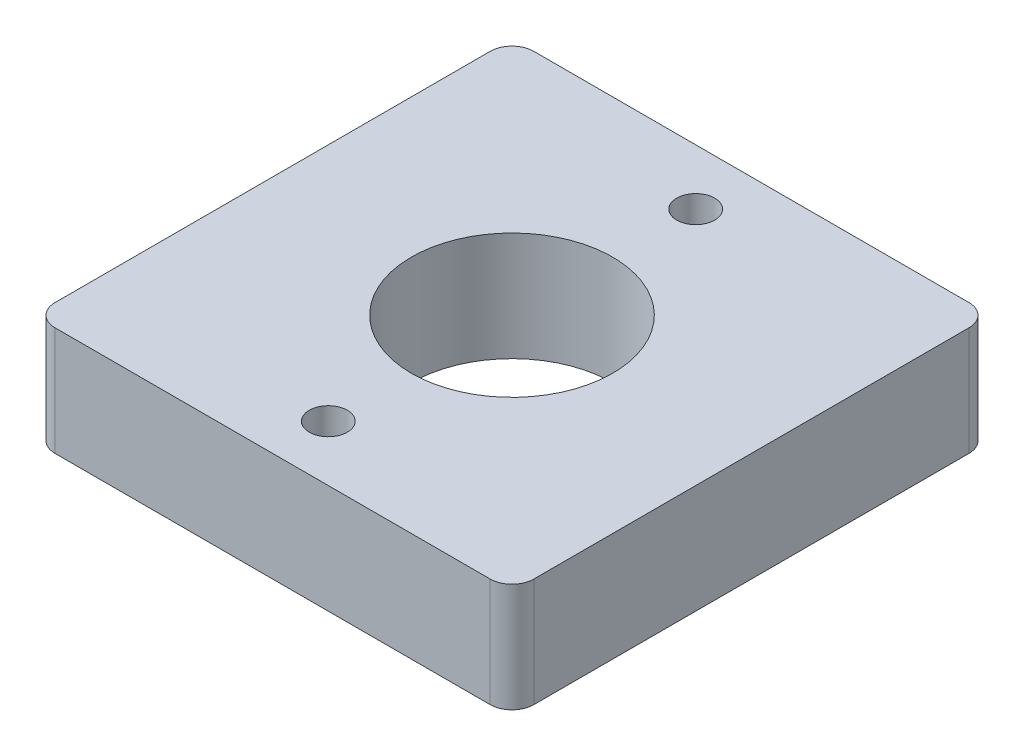
ISO-10303-21;
HEADER;
FILE_DESCRIPTION(('STEP AP214'),'2;1');
FILE_NAME('part.step','',(''),(''),'','','');
FILE_SCHEMA(('AUTOMOTIVE_DESIGN { 1 0 10303 214 1 1 1 1 }'));
ENDSEC;
DATA;
#1=APPLICATION_CONTEXT('core data for automotive mechanical design processes');
#2=APPLICATION_PROTOCOL_DEFINITION('international standard','automotive_design',2000,#1);
#3=PRODUCT_CONTEXT('',#1,'mechanical');
#4=PRODUCT('Part','Part','',(#3));
#5=PRODUCT_RELATED_PRODUCT_CATEGORY('part','',(#4));
#6=PRODUCT_DEFINITION_FORMATION('','',#4);
#7=PRODUCT_DEFINITION_CONTEXT('part definition',#1,'design');
#8=PRODUCT_DEFINITION('design','',#6,#7);
#9=PRODUCT_DEFINITION_SHAPE('','',#8);
#10=(LENGTH_UNIT() NAMED_UNIT(*) SI_UNIT(.MILLI.,.METRE.));
#11=(NAMED_UNIT(*) PLANE_ANGLE_UNIT() SI_UNIT($,.RADIAN.));
#12=(NAMED_UNIT(*) SI_UNIT($,.STERADIAN.) SOLID_ANGLE_UNIT());
#13=UNCERTAINTY_MEASURE_WITH_UNIT(LENGTH_MEASURE(1.E-05),#10,'distance_accuracy_value','');
#14=(GEOMETRIC_REPRESENTATION_CONTEXT(3) GLOBAL_UNCERTAINTY_ASSIGNED_CONTEXT((#13)) GLOBAL_UNIT_ASSIGNED_CONTEXT((#10,
#11,#12)) REPRESENTATION_CONTEXT('',''));
#15=CARTESIAN_POINT('',(0.,0.,0.));
#16=DIRECTION('',(0.,0.,1.));
#17=DIRECTION('',(1.,0.,0.));
#18=AXIS2_PLACEMENT_3D('',#15,#16,#17);
#19=CARTESIAN_POINT('',(0.,10.,0.));
#20=DIRECTION('',(0.,-1.,0.));
#21=DIRECTION('',(0.,0.,-1.));
#22=AXIS2_PLACEMENT_3D('',#19,#20,#21);
#23=PLANE('',#22);
#24=CARTESIAN_POINT('',(0.,10.,-16.88));
#25=DIRECTION('',(0.,1.,0.));
#26=DIRECTION('',(0.,0.,1.));
#27=AXIS2_PLACEMENT_3D('',#24,#25,#26);
#28=CIRCLE('',#27,1.75);
#29=CARTESIAN_POINT('',(0.,10.,-15.13));
#30=VERTEX_POINT('',#29);
#31=EDGE_CURVE('E223',#30,#30,#28,.T.);
#32=ORIENTED_EDGE('',*,*,#31,.F.);
#33=EDGE_LOOP('',(#32));
#34=FACE_BOUND('',#33,.T.);
#35=CARTESIAN_POINT('',(0.,10.,16.88));
#36=DIRECTION('',(0.,1.,0.));
#37=DIRECTION('',(0.,0.,1.));
#38=AXIS2_PLACEMENT_3D('',#35,#36,#37);
#39=CIRCLE('',#38,1.75);
#40=CARTESIAN_POINT('',(0.,10.,18.63));
#41=VERTEX_POINT('',#40);
#42=EDGE_CURVE('E215',#41,#41,#39,.T.);
#43=ORIENTED_EDGE('',*,*,#42,.F.);
#44=EDGE_LOOP('',(#43));
#45=FACE_BOUND('',#44,.T.);
#46=DIRECTION('',(0.,0.,-1.));
#47=VECTOR('',#46,1.);
#48=CARTESIAN_POINT('',(22.,10.,22.));
#49=LINE('',#48,#47);
#50=CARTESIAN_POINT('',(22.,10.,20.));
#51=VERTEX_POINT('',#50);
#52=CARTESIAN_POINT('',(22.,10.,-20.));
#53=VERTEX_POINT('',#52);
#54=EDGE_CURVE('E150',#51,#53,#49,.T.);
#55=ORIENTED_EDGE('',*,*,#54,.T.);
#56=CARTESIAN_POINT('',(20.,10.,-20.));
#57=DIRECTION('',(0.,-1.,0.));
#58=DIRECTION('',(0.,0.,-1.));
#59=AXIS2_PLACEMENT_3D('',#56,#57,#58);
#60=CIRCLE('',#59,2.);
#61=CARTESIAN_POINT('',(20.,10.,-22.));
#62=VERTEX_POINT('',#61);
#63=EDGE_CURVE('E174',#53,#62,#60,.F.);
#64=ORIENTED_EDGE('',*,*,#63,.T.);
#65=DIRECTION('',(-1.,0.,0.));
#66=VECTOR('',#65,1.);
#67=CARTESIAN_POINT('',(-22.,10.,-22.));
#68=LINE('',#67,#66);
#69=CARTESIAN_POINT('',(-20.,10.,-22.));
#70=VERTEX_POINT('',#69);
#71=EDGE_CURVE('E127',#62,#70,#68,.T.);
#72=ORIENTED_EDGE('',*,*,#71,.T.);
#73=CARTESIAN_POINT('',(-20.,10.,-20.));
#74=DIRECTION('',(0.,-1.,0.));
#75=DIRECTION('',(0.,0.,-1.));
#76=AXIS2_PLACEMENT_3D('',#73,#74,#75);
#77=CIRCLE('',#76,2.);
#78=CARTESIAN_POINT('',(-22.,10.,-20.));
#79=VERTEX_POINT('',#78);
#80=EDGE_CURVE('E166',#70,#79,#77,.F.);
#81=ORIENTED_EDGE('',*,*,#80,.T.);
#82=DIRECTION('',(0.,0.,1.));
#83=VECTOR('',#82,1.);
#84=CARTESIAN_POINT('',(-22.,10.,22.));
#85=LINE('',#84,#83);
#86=CARTESIAN_POINT('',(-22.,10.,20.));
#87=VERTEX_POINT('',#86);
#88=EDGE_CURVE('E189',#79,#87,#85,.T.);
#89=ORIENTED_EDGE('',*,*,#88,.T.);
#90=CARTESIAN_POINT('',(-20.,10.,20.));
#91=DIRECTION('',(0.,-1.,0.));
#92=DIRECTION('',(0.,0.,-1.));
#93=AXIS2_PLACEMENT_3D('',#90,#91,#92);
#94=CIRCLE('',#93,2.);
#95=CARTESIAN_POINT('',(-20.,10.,22.));
#96=VERTEX_POINT('',#95);
#97=EDGE_CURVE('E62',#87,#96,#94,.F.);
#98=ORIENTED_EDGE('',*,*,#97,.T.);
#99=DIRECTION('',(1.,0.,0.));
#100=VECTOR('',#99,1.);
#101=CARTESIAN_POINT('',(-22.,10.,22.));
#102=LINE('',#101,#100);
#103=CARTESIAN_POINT('',(20.,10.,22.));
#104=VERTEX_POINT('',#103);
#105=EDGE_CURVE('E152',#96,#104,#102,.T.);
#106=ORIENTED_EDGE('',*,*,#105,.T.);
#107=CARTESIAN_POINT('',(20.,10.,20.));
#108=DIRECTION('',(0.,-1.,0.));
#109=DIRECTION('',(0.,0.,-1.));
#110=AXIS2_PLACEMENT_3D('',#107,#108,#109);
#111=CIRCLE('',#110,2.);
#112=EDGE_CURVE('E171',#104,#51,#111,.F.);
#113=ORIENTED_EDGE('',*,*,#112,.T.);
#114=EDGE_LOOP('',(#55,#64,#72,#81,#89,#98,#106,#113));
#115=FACE_BOUND('',#114,.T.);
#116=CARTESIAN_POINT('',(0.,10.,0.));
#117=DIRECTION('',(0.,1.,0.));
#118=DIRECTION('',(0.,0.,1.));
#119=AXIS2_PLACEMENT_3D('',#116,#117,#118);
#120=CIRCLE('',#119,9.25);
#121=CARTESIAN_POINT('',(0.,10.,9.24999999999999));
#122=VERTEX_POINT('',#121);
#123=EDGE_CURVE('E144',#122,#122,#120,.T.);
#124=ORIENTED_EDGE('',*,*,#123,.F.);
#125=EDGE_LOOP('',(#124));
#126=FACE_BOUND('',#125,.T.);
#127=ADVANCED_FACE('F39',(#34,#45,#115,#126),#23,.F.);
#128=CARTESIAN_POINT('',(0.,0.,0.));
#129=DIRECTION('',(0.,-1.,0.));
#130=DIRECTION('',(0.,0.,-1.));
#131=AXIS2_PLACEMENT_3D('',#128,#129,#130);
#132=PLANE('',#131);
#133=CARTESIAN_POINT('',(0.,0.,-16.88));
#134=DIRECTION('',(0.,1.,0.));
#135=DIRECTION('',(0.,0.,1.));
#136=AXIS2_PLACEMENT_3D('',#133,#134,#135);
#137=CIRCLE('',#136,1.75);
#138=CARTESIAN_POINT('',(0.,0.,-15.13));
#139=VERTEX_POINT('',#138);
#140=EDGE_CURVE('E211',#139,#139,#137,.T.);
#141=ORIENTED_EDGE('',*,*,#140,.T.);
#142=EDGE_LOOP('',(#141));
#143=FACE_BOUND('',#142,.T.);
#144=CARTESIAN_POINT('',(0.,0.,16.88));
#145=DIRECTION('',(0.,1.,0.));
#146=DIRECTION('',(0.,0.,1.));
#147=AXIS2_PLACEMENT_3D('',#144,#145,#146);
#148=CIRCLE('',#147,1.75);
#149=CARTESIAN_POINT('',(0.,0.,18.63));
#150=VERTEX_POINT('',#149);
#151=EDGE_CURVE('E219',#150,#150,#148,.T.);
#152=ORIENTED_EDGE('',*,*,#151,.T.);
#153=EDGE_LOOP('',(#152));
#154=FACE_BOUND('',#153,.T.);
#155=DIRECTION('',(-1.,0.,0.));
#156=VECTOR('',#155,1.);
#157=CARTESIAN_POINT('',(-22.,0.,-22.));
#158=LINE('',#157,#156);
#159=CARTESIAN_POINT('',(20.,0.,-22.));
#160=VERTEX_POINT('',#159);
#161=CARTESIAN_POINT('',(-20.,0.,-22.));
#162=VERTEX_POINT('',#161);
#163=EDGE_CURVE('E124',#160,#162,#158,.T.);
#164=ORIENTED_EDGE('',*,*,#163,.F.);
#165=CARTESIAN_POINT('',(20.,0.,-20.));
#166=DIRECTION('',(0.,-1.,0.));
#167=DIRECTION('',(0.,0.,-1.));
#168=AXIS2_PLACEMENT_3D('',#165,#166,#167);
#169=CIRCLE('',#168,2.);
#170=CARTESIAN_POINT('',(22.,0.,-20.));
#171=VERTEX_POINT('',#170);
#172=EDGE_CURVE('E106',#160,#171,#169,.T.);
#173=ORIENTED_EDGE('',*,*,#172,.T.);
#174=DIRECTION('',(0.,0.,-1.));
#175=VECTOR('',#174,1.);
#176=CARTESIAN_POINT('',(22.,0.,22.));
#177=LINE('',#176,#175);
#178=CARTESIAN_POINT('',(22.,0.,20.));
#179=VERTEX_POINT('',#178);
#180=EDGE_CURVE('E137',#179,#171,#177,.T.);
#181=ORIENTED_EDGE('',*,*,#180,.F.);
#182=CARTESIAN_POINT('',(20.,0.,20.));
#183=DIRECTION('',(0.,-1.,0.));
#184=DIRECTION('',(0.,0.,-1.));
#185=AXIS2_PLACEMENT_3D('',#182,#183,#184);
#186=CIRCLE('',#185,2.);
#187=CARTESIAN_POINT('',(20.,0.,22.));
#188=VERTEX_POINT('',#187);
#189=EDGE_CURVE('E118',#179,#188,#186,.T.);
#190=ORIENTED_EDGE('',*,*,#189,.T.);
#191=DIRECTION('',(1.,0.,0.));
#192=VECTOR('',#191,1.);
#193=CARTESIAN_POINT('',(-22.,0.,22.));
#194=LINE('',#193,#192);
#195=CARTESIAN_POINT('',(-20.,0.,22.));
#196=VERTEX_POINT('',#195);
#197=EDGE_CURVE('E142',#196,#188,#194,.T.);
#198=ORIENTED_EDGE('',*,*,#197,.F.);
#199=CARTESIAN_POINT('',(-20.,0.,20.));
#200=DIRECTION('',(0.,-1.,0.));
#201=DIRECTION('',(0.,0.,-1.));
#202=AXIS2_PLACEMENT_3D('',#199,#200,#201);
#203=CIRCLE('',#202,2.);
#204=CARTESIAN_POINT('',(-22.,0.,20.));
#205=VERTEX_POINT('',#204);
#206=EDGE_CURVE('E156',#196,#205,#203,.T.);
#207=ORIENTED_EDGE('',*,*,#206,.T.);
#208=DIRECTION('',(0.,0.,1.));
#209=VECTOR('',#208,1.);
#210=CARTESIAN_POINT('',(-22.,0.,22.));
#211=LINE('',#210,#209);
#212=CARTESIAN_POINT('',(-22.,0.,-20.));
#213=VERTEX_POINT('',#212);
#214=EDGE_CURVE('E136',#213,#205,#211,.T.);
#215=ORIENTED_EDGE('',*,*,#214,.F.);
#216=CARTESIAN_POINT('',(-20.,0.,-20.));
#217=DIRECTION('',(0.,-1.,0.));
#218=DIRECTION('',(0.,0.,-1.));
#219=AXIS2_PLACEMENT_3D('',#216,#217,#218);
#220=CIRCLE('',#219,2.);
#221=EDGE_CURVE('E129',#213,#162,#220,.T.);
#222=ORIENTED_EDGE('',*,*,#221,.T.);
#223=EDGE_LOOP('',(#164,#173,#181,#190,#198,#207,#215,#222));
#224=FACE_BOUND('',#223,.T.);
#225=CARTESIAN_POINT('',(0.,0.,0.));
#226=DIRECTION('',(0.,1.,0.));
#227=DIRECTION('',(0.,0.,1.));
#228=AXIS2_PLACEMENT_3D('',#225,#226,#227);
#229=CIRCLE('',#228,9.25);
#230=CARTESIAN_POINT('',(0.,0.,9.24999999999999));
#231=VERTEX_POINT('',#230);
#232=EDGE_CURVE('E207',#231,#231,#229,.T.);
#233=ORIENTED_EDGE('',*,*,#232,.T.);
#234=EDGE_LOOP('',(#233));
#235=FACE_BOUND('',#234,.T.);
#236=ADVANCED_FACE('F132',(#143,#154,#224,#235),#132,.T.);
#237=CARTESIAN_POINT('',(22.,10.,22.));
#238=DIRECTION('',(-1.,0.,0.));
#239=DIRECTION('',(0.,0.,1.));
#240=AXIS2_PLACEMENT_3D('',#237,#238,#239);
#241=PLANE('',#240);
#242=ORIENTED_EDGE('',*,*,#180,.T.);
#243=DIRECTION('',(0.,-1.,0.));
#244=VECTOR('',#243,1.);
#245=CARTESIAN_POINT('',(22.,10.,-20.));
#246=LINE('',#245,#244);
#247=EDGE_CURVE('E111',#171,#53,#246,.F.);
#248=ORIENTED_EDGE('',*,*,#247,.T.);
#249=ORIENTED_EDGE('',*,*,#54,.F.);
#250=DIRECTION('',(0.,-1.,0.));
#251=VECTOR('',#250,1.);
#252=CARTESIAN_POINT('',(22.,10.,20.));
#253=LINE('',#252,#251);
#254=EDGE_CURVE('E117',#51,#179,#253,.T.);
#255=ORIENTED_EDGE('',*,*,#254,.T.);
#256=EDGE_LOOP('',(#242,#248,#249,#255));
#257=FACE_BOUND('',#256,.T.);
#258=ADVANCED_FACE('F254',(#257),#241,.F.);
#259=CARTESIAN_POINT('',(-22.,10.,-22.));
#260=DIRECTION('',(0.,0.,1.));
#261=DIRECTION('',(1.,0.,0.));
#262=AXIS2_PLACEMENT_3D('',#259,#260,#261);
#263=PLANE('',#262);
#264=ORIENTED_EDGE('',*,*,#71,.F.);
#265=DIRECTION('',(0.,-1.,0.));
#266=VECTOR('',#265,1.);
#267=CARTESIAN_POINT('',(20.,10.,-22.));
#268=LINE('',#267,#266);
#269=EDGE_CURVE('E110',#62,#160,#268,.T.);
#270=ORIENTED_EDGE('',*,*,#269,.T.);
#271=ORIENTED_EDGE('',*,*,#163,.T.);
#272=DIRECTION('',(0.,-1.,0.));
#273=VECTOR('',#272,1.);
#274=CARTESIAN_POINT('',(-20.,10.,-22.));
#275=LINE('',#274,#273);
#276=EDGE_CURVE('E130',#162,#70,#275,.F.);
#277=ORIENTED_EDGE('',*,*,#276,.T.);
#278=EDGE_LOOP('',(#264,#270,#271,#277));
#279=FACE_BOUND('',#278,.T.);
#280=ADVANCED_FACE('F123',(#279),#263,.F.);
#281=CARTESIAN_POINT('',(-22.,10.,22.));
#282=DIRECTION('',(1.,0.,0.));
#283=DIRECTION('',(0.,0.,-1.));
#284=AXIS2_PLACEMENT_3D('',#281,#282,#283);
#285=PLANE('',#284);
#286=ORIENTED_EDGE('',*,*,#214,.T.);
#287=DIRECTION('',(0.,-1.,0.));
#288=VECTOR('',#287,1.);
#289=CARTESIAN_POINT('',(-22.,10.,20.));
#290=LINE('',#289,#288);
#291=EDGE_CURVE('E11',#205,#87,#290,.F.);
#292=ORIENTED_EDGE('',*,*,#291,.T.);
#293=ORIENTED_EDGE('',*,*,#88,.F.);
#294=DIRECTION('',(0.,-1.,0.));
#295=VECTOR('',#294,1.);
#296=CARTESIAN_POINT('',(-22.,10.,-20.));
#297=LINE('',#296,#295);
#298=EDGE_CURVE('E48',#79,#213,#297,.T.);
#299=ORIENTED_EDGE('',*,*,#298,.T.);
#300=EDGE_LOOP('',(#286,#292,#293,#299));
#301=FACE_BOUND('',#300,.T.);
#302=ADVANCED_FACE('F187',(#301),#285,.F.);
#303=CARTESIAN_POINT('',(-22.,10.,22.));
#304=DIRECTION('',(0.,0.,-1.));
#305=DIRECTION('',(-1.,0.,0.));
#306=AXIS2_PLACEMENT_3D('',#303,#304,#305);
#307=PLANE('',#306);
#308=ORIENTED_EDGE('',*,*,#197,.T.);
#309=DIRECTION('',(0.,-1.,0.));
#310=VECTOR('',#309,1.);
#311=CARTESIAN_POINT('',(20.,10.,22.));
#312=LINE('',#311,#310);
#313=EDGE_CURVE('E55',#188,#104,#312,.F.);
#314=ORIENTED_EDGE('',*,*,#313,.T.);
#315=ORIENTED_EDGE('',*,*,#105,.F.);
#316=DIRECTION('',(0.,-1.,0.));
#317=VECTOR('',#316,1.);
#318=CARTESIAN_POINT('',(-20.,10.,22.));
#319=LINE('',#318,#317);
#320=EDGE_CURVE('E177',#96,#196,#319,.T.);
#321=ORIENTED_EDGE('',*,*,#320,.T.);
#322=EDGE_LOOP('',(#308,#314,#315,#321));
#323=FACE_BOUND('',#322,.T.);
#324=ADVANCED_FACE('F196',(#323),#307,.F.);
#325=CARTESIAN_POINT('',(0.,10.,0.));
#326=DIRECTION('',(0.,-1.,0.));
#327=DIRECTION('',(0.,0.,-1.));
#328=AXIS2_PLACEMENT_3D('',#325,#326,#327);
#329=CYLINDRICAL_SURFACE('',#328,9.25);
#330=ORIENTED_EDGE('',*,*,#123,.T.);
#331=EDGE_LOOP('',(#330));
#332=FACE_BOUND('',#331,.T.);
#333=ORIENTED_EDGE('',*,*,#232,.F.);
#334=EDGE_LOOP('',(#333));
#335=FACE_BOUND('',#334,.T.);
#336=ADVANCED_FACE('F248',(#332,#335),#329,.F.);
#337=CARTESIAN_POINT('',(0.,0.,16.88));
#338=DIRECTION('',(0.,1.,0.));
#339=DIRECTION('',(0.,0.,1.));
#340=AXIS2_PLACEMENT_3D('',#337,#338,#339);
#341=CYLINDRICAL_SURFACE('',#340,1.75);
#342=ORIENTED_EDGE('',*,*,#151,.F.);
#343=EDGE_LOOP('',(#342));
#344=FACE_BOUND('',#343,.T.);
#345=ORIENTED_EDGE('',*,*,#42,.T.);
#346=EDGE_LOOP('',(#345));
#347=FACE_BOUND('',#346,.T.);
#348=ADVANCED_FACE('F236',(#344,#347),#341,.F.);
#349=CARTESIAN_POINT('',(0.,0.,-16.88));
#350=DIRECTION('',(0.,1.,0.));
#351=DIRECTION('',(0.,0.,1.));
#352=AXIS2_PLACEMENT_3D('',#349,#350,#351);
#353=CYLINDRICAL_SURFACE('',#352,1.75);
#354=ORIENTED_EDGE('',*,*,#140,.F.);
#355=EDGE_LOOP('',(#354));
#356=FACE_BOUND('',#355,.T.);
#357=ORIENTED_EDGE('',*,*,#31,.T.);
#358=EDGE_LOOP('',(#357));
#359=FACE_BOUND('',#358,.T.);
#360=ADVANCED_FACE('F233',(#356,#359),#353,.F.);
#361=CARTESIAN_POINT('',(20.,10.,-20.));
#362=DIRECTION('',(0.,-1.,0.));
#363=DIRECTION('',(0.,0.,-1.));
#364=AXIS2_PLACEMENT_3D('',#361,#362,#363);
#365=CYLINDRICAL_SURFACE('',#364,2.);
#366=ORIENTED_EDGE('',*,*,#63,.F.);
#367=ORIENTED_EDGE('',*,*,#247,.F.);
#368=ORIENTED_EDGE('',*,*,#172,.F.);
#369=ORIENTED_EDGE('',*,*,#269,.F.);
#370=EDGE_LOOP('',(#366,#367,#368,#369));
#371=FACE_BOUND('',#370,.T.);
#372=ADVANCED_FACE('F109',(#371),#365,.T.);
#373=CARTESIAN_POINT('',(20.,10.,20.));
#374=DIRECTION('',(0.,-1.,0.));
#375=DIRECTION('',(0.,0.,-1.));
#376=AXIS2_PLACEMENT_3D('',#373,#374,#375);
#377=CYLINDRICAL_SURFACE('',#376,2.);
#378=ORIENTED_EDGE('',*,*,#112,.F.);
#379=ORIENTED_EDGE('',*,*,#313,.F.);
#380=ORIENTED_EDGE('',*,*,#189,.F.);
#381=ORIENTED_EDGE('',*,*,#254,.F.);
#382=EDGE_LOOP('',(#378,#379,#380,#381));
#383=FACE_BOUND('',#382,.T.);
#384=ADVANCED_FACE('F270',(#383),#377,.T.);
#385=CARTESIAN_POINT('',(-20.,10.,20.));
#386=DIRECTION('',(0.,-1.,0.));
#387=DIRECTION('',(0.,0.,-1.));
#388=AXIS2_PLACEMENT_3D('',#385,#386,#387);
#389=CYLINDRICAL_SURFACE('',#388,2.);
#390=ORIENTED_EDGE('',*,*,#97,.F.);
#391=ORIENTED_EDGE('',*,*,#291,.F.);
#392=ORIENTED_EDGE('',*,*,#206,.F.);
#393=ORIENTED_EDGE('',*,*,#320,.F.);
#394=EDGE_LOOP('',(#390,#391,#392,#393));
#395=FACE_BOUND('',#394,.T.);
#396=ADVANCED_FACE('F195',(#395),#389,.T.);
#397=CARTESIAN_POINT('',(-20.,10.,-20.));
#398=DIRECTION('',(0.,-1.,0.));
#399=DIRECTION('',(0.,0.,-1.));
#400=AXIS2_PLACEMENT_3D('',#397,#398,#399);
#401=CYLINDRICAL_SURFACE('',#400,2.);
#402=ORIENTED_EDGE('',*,*,#80,.F.);
#403=ORIENTED_EDGE('',*,*,#276,.F.);
#404=ORIENTED_EDGE('',*,*,#221,.F.);
#405=ORIENTED_EDGE('',*,*,#298,.F.);
#406=EDGE_LOOP('',(#402,#403,#404,#405));
#407=FACE_BOUND('',#406,.T.);
#408=ADVANCED_FACE('F41',(#407),#401,.T.);
#409=CLOSED_SHELL('',(#127,#236,#258,#280,#302,#324,#336,#348,#360,#372,#384,#396,#408));
#410=MANIFOLD_SOLID_BREP('B2',#409);
#411=ADVANCED_BREP_SHAPE_REPRESENTATION('',(#18,#410),#14);
#412=SHAPE_DEFINITION_REPRESENTATION(#9,#411);
ENDSEC;
END-ISO-10303-21;
